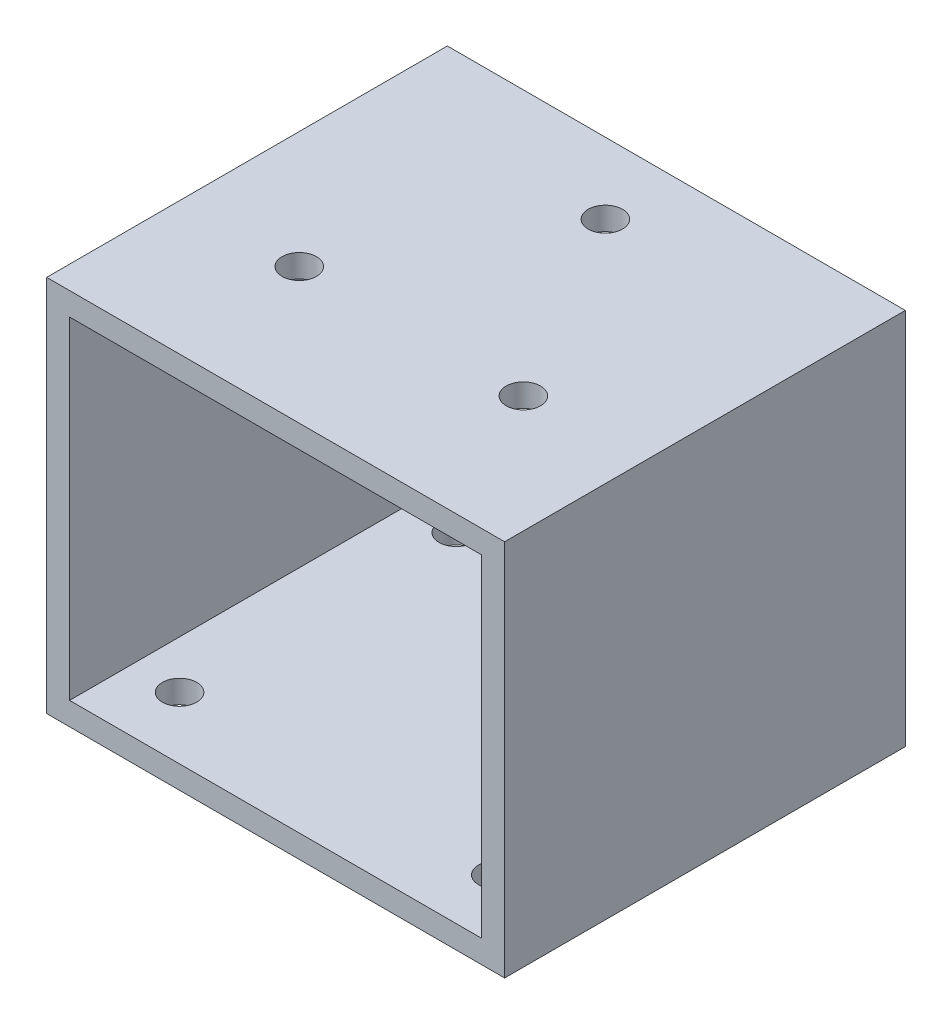
ISO-10303-21;
HEADER;
FILE_DESCRIPTION(('STEP AP214'),'2;1');
FILE_NAME('part.step','',(''),(''),'','','');
FILE_SCHEMA(('AUTOMOTIVE_DESIGN { 1 0 10303 214 1 1 1 1 }'));
ENDSEC;
DATA;
#1=APPLICATION_CONTEXT('core data for automotive mechanical design processes');
#2=APPLICATION_PROTOCOL_DEFINITION('international standard','automotive_design',2000,#1);
#3=PRODUCT_CONTEXT('',#1,'mechanical');
#4=PRODUCT('Part','Part','',(#3));
#5=PRODUCT_RELATED_PRODUCT_CATEGORY('part','',(#4));
#6=PRODUCT_DEFINITION_FORMATION('','',#4);
#7=PRODUCT_DEFINITION_CONTEXT('part definition',#1,'design');
#8=PRODUCT_DEFINITION('design','',#6,#7);
#9=PRODUCT_DEFINITION_SHAPE('','',#8);
#10=(LENGTH_UNIT() NAMED_UNIT(*) SI_UNIT(.MILLI.,.METRE.));
#11=(NAMED_UNIT(*) PLANE_ANGLE_UNIT() SI_UNIT($,.RADIAN.));
#12=(NAMED_UNIT(*) SI_UNIT($,.STERADIAN.) SOLID_ANGLE_UNIT());
#13=UNCERTAINTY_MEASURE_WITH_UNIT(LENGTH_MEASURE(1.E-05),#10,'distance_accuracy_value','');
#14=(GEOMETRIC_REPRESENTATION_CONTEXT(3) GLOBAL_UNCERTAINTY_ASSIGNED_CONTEXT((#13)) GLOBAL_UNIT_ASSIGNED_CONTEXT((#10,
#11,#12)) REPRESENTATION_CONTEXT('',''));
#15=CARTESIAN_POINT('',(0.,0.,0.));
#16=DIRECTION('',(0.,0.,1.));
#17=DIRECTION('',(1.,0.,0.));
#18=AXIS2_PLACEMENT_3D('',#15,#16,#17);
#19=CARTESIAN_POINT('',(0.,0.,35.));
#20=DIRECTION('',(0.,0.,1.));
#21=DIRECTION('',(1.,0.,0.));
#22=AXIS2_PLACEMENT_3D('',#19,#20,#21);
#23=PLANE('',#22);
#24=DIRECTION('',(0.,-1.,0.));
#25=VECTOR('',#24,1.);
#26=CARTESIAN_POINT('',(-20.,16.5,35.));
#27=LINE('',#26,#25);
#28=CARTESIAN_POINT('',(-20.,16.5,35.));
#29=VERTEX_POINT('',#28);
#30=CARTESIAN_POINT('',(-20.,-16.5,35.));
#31=VERTEX_POINT('',#30);
#32=EDGE_CURVE('E138',#29,#31,#27,.T.);
#33=ORIENTED_EDGE('',*,*,#32,.T.);
#34=DIRECTION('',(1.,0.,0.));
#35=VECTOR('',#34,1.);
#36=CARTESIAN_POINT('',(-20.,-16.5,35.));
#37=LINE('',#36,#35);
#38=CARTESIAN_POINT('',(20.,-16.5,35.));
#39=VERTEX_POINT('',#38);
#40=EDGE_CURVE('E141',#31,#39,#37,.T.);
#41=ORIENTED_EDGE('',*,*,#40,.T.);
#42=DIRECTION('',(0.,1.,0.));
#43=VECTOR('',#42,1.);
#44=CARTESIAN_POINT('',(20.,16.5,35.));
#45=LINE('',#44,#43);
#46=CARTESIAN_POINT('',(20.,16.5,35.));
#47=VERTEX_POINT('',#46);
#48=EDGE_CURVE('E144',#39,#47,#45,.T.);
#49=ORIENTED_EDGE('',*,*,#48,.T.);
#50=DIRECTION('',(-1.,0.,0.));
#51=VECTOR('',#50,1.);
#52=CARTESIAN_POINT('',(-20.,16.5,35.));
#53=LINE('',#52,#51);
#54=EDGE_CURVE('E146',#47,#29,#53,.T.);
#55=ORIENTED_EDGE('',*,*,#54,.T.);
#56=EDGE_LOOP('',(#33,#41,#49,#55));
#57=FACE_BOUND('',#56,.T.);
#58=DIRECTION('',(1.,0.,0.));
#59=VECTOR('',#58,1.);
#60=CARTESIAN_POINT('',(-18.,-14.5,35.));
#61=LINE('',#60,#59);
#62=CARTESIAN_POINT('',(-18.,-14.5,35.));
#63=VERTEX_POINT('',#62);
#64=CARTESIAN_POINT('',(18.,-14.5,35.));
#65=VERTEX_POINT('',#64);
#66=EDGE_CURVE('E108',#63,#65,#61,.T.);
#67=ORIENTED_EDGE('',*,*,#66,.F.);
#68=DIRECTION('',(0.,-1.,0.));
#69=VECTOR('',#68,1.);
#70=CARTESIAN_POINT('',(-18.,14.5,35.));
#71=LINE('',#70,#69);
#72=CARTESIAN_POINT('',(-18.,14.5,35.));
#73=VERTEX_POINT('',#72);
#74=EDGE_CURVE('E100',#73,#63,#71,.T.);
#75=ORIENTED_EDGE('',*,*,#74,.F.);
#76=DIRECTION('',(-1.,0.,0.));
#77=VECTOR('',#76,1.);
#78=CARTESIAN_POINT('',(-18.,14.5,35.));
#79=LINE('',#78,#77);
#80=CARTESIAN_POINT('',(18.,14.5,35.));
#81=VERTEX_POINT('',#80);
#82=EDGE_CURVE('E122',#81,#73,#79,.T.);
#83=ORIENTED_EDGE('',*,*,#82,.F.);
#84=DIRECTION('',(0.,1.,0.));
#85=VECTOR('',#84,1.);
#86=CARTESIAN_POINT('',(18.,14.5,35.));
#87=LINE('',#86,#85);
#88=EDGE_CURVE('E120',#65,#81,#87,.T.);
#89=ORIENTED_EDGE('',*,*,#88,.F.);
#90=EDGE_LOOP('',(#67,#75,#83,#89));
#91=FACE_BOUND('',#90,.T.);
#92=ADVANCED_FACE('F33',(#57,#91),#23,.T.);
#93=CARTESIAN_POINT('',(0.,0.,0.));
#94=DIRECTION('',(0.,0.,1.));
#95=DIRECTION('',(1.,0.,0.));
#96=AXIS2_PLACEMENT_3D('',#93,#94,#95);
#97=PLANE('',#96);
#98=DIRECTION('',(0.,-1.,0.));
#99=VECTOR('',#98,1.);
#100=CARTESIAN_POINT('',(-20.,16.5,0.));
#101=LINE('',#100,#99);
#102=CARTESIAN_POINT('',(-20.,16.5,0.));
#103=VERTEX_POINT('',#102);
#104=CARTESIAN_POINT('',(-20.,-16.5,0.));
#105=VERTEX_POINT('',#104);
#106=EDGE_CURVE('E116',#103,#105,#101,.T.);
#107=ORIENTED_EDGE('',*,*,#106,.F.);
#108=DIRECTION('',(-1.,0.,0.));
#109=VECTOR('',#108,1.);
#110=CARTESIAN_POINT('',(-20.,16.5,0.));
#111=LINE('',#110,#109);
#112=CARTESIAN_POINT('',(20.,16.5,0.));
#113=VERTEX_POINT('',#112);
#114=EDGE_CURVE('E142',#113,#103,#111,.T.);
#115=ORIENTED_EDGE('',*,*,#114,.F.);
#116=DIRECTION('',(0.,1.,0.));
#117=VECTOR('',#116,1.);
#118=CARTESIAN_POINT('',(20.,16.5,0.));
#119=LINE('',#118,#117);
#120=CARTESIAN_POINT('',(20.,-16.5,0.));
#121=VERTEX_POINT('',#120);
#122=EDGE_CURVE('E153',#121,#113,#119,.T.);
#123=ORIENTED_EDGE('',*,*,#122,.F.);
#124=DIRECTION('',(1.,0.,0.));
#125=VECTOR('',#124,1.);
#126=CARTESIAN_POINT('',(-20.,-16.5,0.));
#127=LINE('',#126,#125);
#128=EDGE_CURVE('E151',#105,#121,#127,.T.);
#129=ORIENTED_EDGE('',*,*,#128,.F.);
#130=EDGE_LOOP('',(#107,#115,#123,#129));
#131=FACE_BOUND('',#130,.T.);
#132=DIRECTION('',(0.,-1.,0.));
#133=VECTOR('',#132,1.);
#134=CARTESIAN_POINT('',(-18.,14.5,0.));
#135=LINE('',#134,#133);
#136=CARTESIAN_POINT('',(-18.,14.5,0.));
#137=VERTEX_POINT('',#136);
#138=CARTESIAN_POINT('',(-18.,-14.5,0.));
#139=VERTEX_POINT('',#138);
#140=EDGE_CURVE('E58',#137,#139,#135,.T.);
#141=ORIENTED_EDGE('',*,*,#140,.T.);
#142=DIRECTION('',(1.,0.,0.));
#143=VECTOR('',#142,1.);
#144=CARTESIAN_POINT('',(-18.,-14.5,0.));
#145=LINE('',#144,#143);
#146=CARTESIAN_POINT('',(18.,-14.5,0.));
#147=VERTEX_POINT('',#146);
#148=EDGE_CURVE('E115',#139,#147,#145,.T.);
#149=ORIENTED_EDGE('',*,*,#148,.T.);
#150=DIRECTION('',(0.,1.,0.));
#151=VECTOR('',#150,1.);
#152=CARTESIAN_POINT('',(18.,14.5,0.));
#153=LINE('',#152,#151);
#154=CARTESIAN_POINT('',(18.,14.5,0.));
#155=VERTEX_POINT('',#154);
#156=EDGE_CURVE('E130',#147,#155,#153,.T.);
#157=ORIENTED_EDGE('',*,*,#156,.T.);
#158=DIRECTION('',(-1.,0.,0.));
#159=VECTOR('',#158,1.);
#160=CARTESIAN_POINT('',(-18.,14.5,0.));
#161=LINE('',#160,#159);
#162=EDGE_CURVE('E109',#155,#137,#161,.T.);
#163=ORIENTED_EDGE('',*,*,#162,.T.);
#164=EDGE_LOOP('',(#141,#149,#157,#163));
#165=FACE_BOUND('',#164,.T.);
#166=ADVANCED_FACE('F225',(#131,#165),#97,.F.);
#167=CARTESIAN_POINT('',(-20.,16.5,35.));
#168=DIRECTION('',(1.,0.,0.));
#169=DIRECTION('',(0.,0.,-1.));
#170=AXIS2_PLACEMENT_3D('',#167,#168,#169);
#171=PLANE('',#170);
#172=ORIENTED_EDGE('',*,*,#106,.T.);
#173=DIRECTION('',(0.,0.,-1.));
#174=VECTOR('',#173,1.);
#175=CARTESIAN_POINT('',(-20.,-16.5,35.));
#176=LINE('',#175,#174);
#177=EDGE_CURVE('E11',#31,#105,#176,.T.);
#178=ORIENTED_EDGE('',*,*,#177,.F.);
#179=ORIENTED_EDGE('',*,*,#32,.F.);
#180=DIRECTION('',(0.,0.,-1.));
#181=VECTOR('',#180,1.);
#182=CARTESIAN_POINT('',(-20.,16.5,35.));
#183=LINE('',#182,#181);
#184=EDGE_CURVE('E148',#29,#103,#183,.T.);
#185=ORIENTED_EDGE('',*,*,#184,.T.);
#186=EDGE_LOOP('',(#172,#178,#179,#185));
#187=FACE_BOUND('',#186,.T.);
#188=ADVANCED_FACE('F35',(#187),#171,.F.);
#189=CARTESIAN_POINT('',(-20.,-16.5,35.));
#190=DIRECTION('',(0.,1.,0.));
#191=DIRECTION('',(-1.,0.,0.));
#192=AXIS2_PLACEMENT_3D('',#189,#190,#191);
#193=PLANE('',#192);
#194=CARTESIAN_POINT('',(-13.8094685788079,-16.5,29.5832850064569));
#195=DIRECTION('',(0.,-1.,0.));
#196=DIRECTION('',(1.,0.,0.));
#197=AXIS2_PLACEMENT_3D('',#194,#195,#196);
#198=CIRCLE('',#197,1.5);
#199=CARTESIAN_POINT('',(-12.3094685788079,-16.5,29.5832850064569));
#200=VERTEX_POINT('',#199);
#201=EDGE_CURVE('E197',#200,#200,#198,.T.);
#202=ORIENTED_EDGE('',*,*,#201,.F.);
#203=EDGE_LOOP('',(#202));
#204=FACE_BOUND('',#203,.T.);
#205=CARTESIAN_POINT('',(13.8094685788079,-16.5,5.41671499354309));
#206=DIRECTION('',(0.,-1.,0.));
#207=DIRECTION('',(-1.,0.,0.));
#208=AXIS2_PLACEMENT_3D('',#205,#206,#207);
#209=CIRCLE('',#208,1.5);
#210=CARTESIAN_POINT('',(12.3094685788079,-16.5,5.41671499354309));
#211=VERTEX_POINT('',#210);
#212=EDGE_CURVE('E198',#211,#211,#209,.T.);
#213=ORIENTED_EDGE('',*,*,#212,.F.);
#214=EDGE_LOOP('',(#213));
#215=FACE_BOUND('',#214,.T.);
#216=CARTESIAN_POINT('',(-13.8094685788079,-16.5,5.41671499354309));
#217=DIRECTION('',(0.,-1.,0.));
#218=DIRECTION('',(-1.,0.,0.));
#219=AXIS2_PLACEMENT_3D('',#216,#217,#218);
#220=CIRCLE('',#219,1.5);
#221=CARTESIAN_POINT('',(-15.3094685788079,-16.5,5.41671499354309));
#222=VERTEX_POINT('',#221);
#223=EDGE_CURVE('E201',#222,#222,#220,.T.);
#224=ORIENTED_EDGE('',*,*,#223,.F.);
#225=EDGE_LOOP('',(#224));
#226=FACE_BOUND('',#225,.T.);
#227=CARTESIAN_POINT('',(13.8094685788079,-16.5,29.5832850064569));
#228=DIRECTION('',(0.,-1.,0.));
#229=DIRECTION('',(1.,0.,0.));
#230=AXIS2_PLACEMENT_3D('',#227,#228,#229);
#231=CIRCLE('',#230,1.5);
#232=CARTESIAN_POINT('',(15.3094685788079,-16.5,29.5832850064569));
#233=VERTEX_POINT('',#232);
#234=EDGE_CURVE('E176',#233,#233,#231,.T.);
#235=ORIENTED_EDGE('',*,*,#234,.F.);
#236=EDGE_LOOP('',(#235));
#237=FACE_BOUND('',#236,.T.);
#238=ORIENTED_EDGE('',*,*,#128,.T.);
#239=DIRECTION('',(0.,0.,-1.));
#240=VECTOR('',#239,1.);
#241=CARTESIAN_POINT('',(20.,-16.5,35.));
#242=LINE('',#241,#240);
#243=EDGE_CURVE('E42',#39,#121,#242,.T.);
#244=ORIENTED_EDGE('',*,*,#243,.F.);
#245=ORIENTED_EDGE('',*,*,#40,.F.);
#246=ORIENTED_EDGE('',*,*,#177,.T.);
#247=EDGE_LOOP('',(#238,#244,#245,#246));
#248=FACE_BOUND('',#247,.T.);
#249=ADVANCED_FACE('F209',(#204,#215,#226,#237,#248),#193,.F.);
#250=CARTESIAN_POINT('',(20.,16.5,35.));
#251=DIRECTION('',(-1.,0.,0.));
#252=DIRECTION('',(0.,-1.,0.));
#253=AXIS2_PLACEMENT_3D('',#250,#251,#252);
#254=PLANE('',#253);
#255=ORIENTED_EDGE('',*,*,#122,.T.);
#256=DIRECTION('',(0.,0.,-1.));
#257=VECTOR('',#256,1.);
#258=CARTESIAN_POINT('',(20.,16.5,35.));
#259=LINE('',#258,#257);
#260=EDGE_CURVE('E158',#47,#113,#259,.T.);
#261=ORIENTED_EDGE('',*,*,#260,.F.);
#262=ORIENTED_EDGE('',*,*,#48,.F.);
#263=ORIENTED_EDGE('',*,*,#243,.T.);
#264=EDGE_LOOP('',(#255,#261,#262,#263));
#265=FACE_BOUND('',#264,.T.);
#266=ADVANCED_FACE('F212',(#265),#254,.F.);
#267=CARTESIAN_POINT('',(-20.,16.5,35.));
#268=DIRECTION('',(0.,-1.,0.));
#269=DIRECTION('',(1.,0.,0.));
#270=AXIS2_PLACEMENT_3D('',#267,#268,#269);
#271=PLANE('',#270);
#272=CARTESIAN_POINT('',(0.,16.5,6.2));
#273=DIRECTION('',(0.,1.,0.));
#274=DIRECTION('',(-1.,0.,0.));
#275=AXIS2_PLACEMENT_3D('',#272,#273,#274);
#276=CIRCLE('',#275,1.5);
#277=CARTESIAN_POINT('',(-1.5,16.5,6.2));
#278=VERTEX_POINT('',#277);
#279=EDGE_CURVE('E167',#278,#278,#276,.T.);
#280=ORIENTED_EDGE('',*,*,#279,.F.);
#281=EDGE_LOOP('',(#280));
#282=FACE_BOUND('',#281,.T.);
#283=CARTESIAN_POINT('',(9.78608706276461,16.5,23.1499999999998));
#284=DIRECTION('',(0.,1.,0.));
#285=DIRECTION('',(-1.,0.,0.));
#286=AXIS2_PLACEMENT_3D('',#283,#284,#285);
#287=CIRCLE('',#286,1.5);
#288=CARTESIAN_POINT('',(8.28608706276461,16.5,23.1499999999998));
#289=VERTEX_POINT('',#288);
#290=EDGE_CURVE('E187',#289,#289,#287,.T.);
#291=ORIENTED_EDGE('',*,*,#290,.F.);
#292=EDGE_LOOP('',(#291));
#293=FACE_BOUND('',#292,.T.);
#294=CARTESIAN_POINT('',(-9.78608706276374,16.5,23.1500000000002));
#295=DIRECTION('',(0.,1.,0.));
#296=DIRECTION('',(-1.,0.,0.));
#297=AXIS2_PLACEMENT_3D('',#294,#295,#296);
#298=CIRCLE('',#297,1.5);
#299=CARTESIAN_POINT('',(-11.2860870627637,16.5,23.1500000000002));
#300=VERTEX_POINT('',#299);
#301=EDGE_CURVE('E183',#300,#300,#298,.T.);
#302=ORIENTED_EDGE('',*,*,#301,.F.);
#303=EDGE_LOOP('',(#302));
#304=FACE_BOUND('',#303,.T.);
#305=ORIENTED_EDGE('',*,*,#114,.T.);
#306=ORIENTED_EDGE('',*,*,#184,.F.);
#307=ORIENTED_EDGE('',*,*,#54,.F.);
#308=ORIENTED_EDGE('',*,*,#260,.T.);
#309=EDGE_LOOP('',(#305,#306,#307,#308));
#310=FACE_BOUND('',#309,.T.);
#311=ADVANCED_FACE('F229',(#282,#293,#304,#310),#271,.F.);
#312=CARTESIAN_POINT('',(-18.,14.5,35.));
#313=DIRECTION('',(1.,0.,0.));
#314=DIRECTION('',(0.,0.,-1.));
#315=AXIS2_PLACEMENT_3D('',#312,#313,#314);
#316=PLANE('',#315);
#317=ORIENTED_EDGE('',*,*,#140,.F.);
#318=DIRECTION('',(0.,0.,-1.));
#319=VECTOR('',#318,1.);
#320=CARTESIAN_POINT('',(-18.,14.5,35.));
#321=LINE('',#320,#319);
#322=EDGE_CURVE('E104',#73,#137,#321,.T.);
#323=ORIENTED_EDGE('',*,*,#322,.F.);
#324=ORIENTED_EDGE('',*,*,#74,.T.);
#325=DIRECTION('',(0.,0.,-1.));
#326=VECTOR('',#325,1.);
#327=CARTESIAN_POINT('',(-18.,-14.5,35.));
#328=LINE('',#327,#326);
#329=EDGE_CURVE('E103',#63,#139,#328,.T.);
#330=ORIENTED_EDGE('',*,*,#329,.T.);
#331=EDGE_LOOP('',(#317,#323,#324,#330));
#332=FACE_BOUND('',#331,.T.);
#333=ADVANCED_FACE('F102',(#332),#316,.T.);
#334=CARTESIAN_POINT('',(-18.,-14.5,35.));
#335=DIRECTION('',(0.,1.,0.));
#336=DIRECTION('',(-1.,0.,0.));
#337=AXIS2_PLACEMENT_3D('',#334,#335,#336);
#338=PLANE('',#337);
#339=CARTESIAN_POINT('',(-13.8094685788079,-14.5,29.5832850064569));
#340=DIRECTION('',(0.,1.,0.));
#341=DIRECTION('',(-1.,0.,0.));
#342=AXIS2_PLACEMENT_3D('',#339,#340,#341);
#343=CIRCLE('',#342,1.5);
#344=CARTESIAN_POINT('',(-15.3094685788079,-14.5,29.5832850064569));
#345=VERTEX_POINT('',#344);
#346=EDGE_CURVE('E37',#345,#345,#343,.T.);
#347=ORIENTED_EDGE('',*,*,#346,.F.);
#348=EDGE_LOOP('',(#347));
#349=FACE_BOUND('',#348,.T.);
#350=CARTESIAN_POINT('',(13.8094685788079,-14.5,5.41671499354309));
#351=DIRECTION('',(0.,1.,0.));
#352=DIRECTION('',(-1.,0.,0.));
#353=AXIS2_PLACEMENT_3D('',#350,#351,#352);
#354=CIRCLE('',#353,1.5);
#355=CARTESIAN_POINT('',(12.3094685788079,-14.5,5.41671499354309));
#356=VERTEX_POINT('',#355);
#357=EDGE_CURVE('E178',#356,#356,#354,.T.);
#358=ORIENTED_EDGE('',*,*,#357,.F.);
#359=EDGE_LOOP('',(#358));
#360=FACE_BOUND('',#359,.T.);
#361=CARTESIAN_POINT('',(-13.8094685788079,-14.5,5.41671499354309));
#362=DIRECTION('',(0.,1.,0.));
#363=DIRECTION('',(-1.,0.,0.));
#364=AXIS2_PLACEMENT_3D('',#361,#362,#363);
#365=CIRCLE('',#364,1.5);
#366=CARTESIAN_POINT('',(-15.3094685788079,-14.5,5.41671499354309));
#367=VERTEX_POINT('',#366);
#368=EDGE_CURVE('E175',#367,#367,#365,.T.);
#369=ORIENTED_EDGE('',*,*,#368,.F.);
#370=EDGE_LOOP('',(#369));
#371=FACE_BOUND('',#370,.T.);
#372=CARTESIAN_POINT('',(13.8094685788079,-14.5,29.5832850064569));
#373=DIRECTION('',(0.,1.,0.));
#374=DIRECTION('',(-1.,0.,0.));
#375=AXIS2_PLACEMENT_3D('',#372,#373,#374);
#376=CIRCLE('',#375,1.5);
#377=CARTESIAN_POINT('',(12.3094685788079,-14.5,29.5832850064569));
#378=VERTEX_POINT('',#377);
#379=EDGE_CURVE('E172',#378,#378,#376,.T.);
#380=ORIENTED_EDGE('',*,*,#379,.F.);
#381=EDGE_LOOP('',(#380));
#382=FACE_BOUND('',#381,.T.);
#383=ORIENTED_EDGE('',*,*,#148,.F.);
#384=ORIENTED_EDGE('',*,*,#329,.F.);
#385=ORIENTED_EDGE('',*,*,#66,.T.);
#386=DIRECTION('',(0.,0.,-1.));
#387=VECTOR('',#386,1.);
#388=CARTESIAN_POINT('',(18.,-14.5,35.));
#389=LINE('',#388,#387);
#390=EDGE_CURVE('E117',#65,#147,#389,.T.);
#391=ORIENTED_EDGE('',*,*,#390,.T.);
#392=EDGE_LOOP('',(#383,#384,#385,#391));
#393=FACE_BOUND('',#392,.T.);
#394=ADVANCED_FACE('F112',(#349,#360,#371,#382,#393),#338,.T.);
#395=CARTESIAN_POINT('',(18.,14.5,35.));
#396=DIRECTION('',(-1.,0.,0.));
#397=DIRECTION('',(0.,-1.,0.));
#398=AXIS2_PLACEMENT_3D('',#395,#396,#397);
#399=PLANE('',#398);
#400=ORIENTED_EDGE('',*,*,#156,.F.);
#401=ORIENTED_EDGE('',*,*,#390,.F.);
#402=ORIENTED_EDGE('',*,*,#88,.T.);
#403=DIRECTION('',(0.,0.,-1.));
#404=VECTOR('',#403,1.);
#405=CARTESIAN_POINT('',(18.,14.5,35.));
#406=LINE('',#405,#404);
#407=EDGE_CURVE('E50',#81,#155,#406,.T.);
#408=ORIENTED_EDGE('',*,*,#407,.T.);
#409=EDGE_LOOP('',(#400,#401,#402,#408));
#410=FACE_BOUND('',#409,.T.);
#411=ADVANCED_FACE('F274',(#410),#399,.T.);
#412=CARTESIAN_POINT('',(-18.,14.5,35.));
#413=DIRECTION('',(0.,-1.,0.));
#414=DIRECTION('',(0.,0.,-1.));
#415=AXIS2_PLACEMENT_3D('',#412,#413,#414);
#416=PLANE('',#415);
#417=CARTESIAN_POINT('',(0.,14.5,6.2));
#418=DIRECTION('',(0.,-1.,0.));
#419=DIRECTION('',(0.,0.,-1.));
#420=AXIS2_PLACEMENT_3D('',#417,#418,#419);
#421=CIRCLE('',#420,1.5);
#422=CARTESIAN_POINT('',(0.,14.5,4.7));
#423=VERTEX_POINT('',#422);
#424=EDGE_CURVE('E128',#423,#423,#421,.T.);
#425=ORIENTED_EDGE('',*,*,#424,.F.);
#426=EDGE_LOOP('',(#425));
#427=FACE_BOUND('',#426,.T.);
#428=CARTESIAN_POINT('',(9.78608706276461,14.5,23.1499999999998));
#429=DIRECTION('',(0.,-1.,0.));
#430=DIRECTION('',(0.,0.,-1.));
#431=AXIS2_PLACEMENT_3D('',#428,#429,#430);
#432=CIRCLE('',#431,1.5);
#433=CARTESIAN_POINT('',(9.78608706276461,14.5,21.6499999999998));
#434=VERTEX_POINT('',#433);
#435=EDGE_CURVE('E166',#434,#434,#432,.T.);
#436=ORIENTED_EDGE('',*,*,#435,.F.);
#437=EDGE_LOOP('',(#436));
#438=FACE_BOUND('',#437,.T.);
#439=CARTESIAN_POINT('',(-9.78608706276374,14.5,23.1500000000002));
#440=DIRECTION('',(0.,-1.,0.));
#441=DIRECTION('',(0.,0.,-1.));
#442=AXIS2_PLACEMENT_3D('',#439,#440,#441);
#443=CIRCLE('',#442,1.5);
#444=CARTESIAN_POINT('',(-9.78608706276374,14.5,21.6500000000002));
#445=VERTEX_POINT('',#444);
#446=EDGE_CURVE('E163',#445,#445,#443,.T.);
#447=ORIENTED_EDGE('',*,*,#446,.F.);
#448=EDGE_LOOP('',(#447));
#449=FACE_BOUND('',#448,.T.);
#450=ORIENTED_EDGE('',*,*,#162,.F.);
#451=ORIENTED_EDGE('',*,*,#407,.F.);
#452=ORIENTED_EDGE('',*,*,#82,.T.);
#453=ORIENTED_EDGE('',*,*,#322,.T.);
#454=EDGE_LOOP('',(#450,#451,#452,#453));
#455=FACE_BOUND('',#454,.T.);
#456=ADVANCED_FACE('F283',(#427,#438,#449,#455),#416,.T.);
#457=CARTESIAN_POINT('',(-9.78608706276373,1.50000000000002,23.1500000000002));
#458=DIRECTION('',(0.,1.,0.));
#459=DIRECTION('',(-1.,0.,0.));
#460=AXIS2_PLACEMENT_3D('',#457,#458,#459);
#461=CYLINDRICAL_SURFACE('',#460,1.5);
#462=ORIENTED_EDGE('',*,*,#446,.T.);
#463=EDGE_LOOP('',(#462));
#464=FACE_BOUND('',#463,.T.);
#465=ORIENTED_EDGE('',*,*,#301,.T.);
#466=EDGE_LOOP('',(#465));
#467=FACE_BOUND('',#466,.T.);
#468=ADVANCED_FACE('F290',(#464,#467),#461,.F.);
#469=CARTESIAN_POINT('',(9.78608706276461,1.50000000000002,23.1499999999998));
#470=DIRECTION('',(0.,1.,0.));
#471=DIRECTION('',(-1.,0.,0.));
#472=AXIS2_PLACEMENT_3D('',#469,#470,#471);
#473=CYLINDRICAL_SURFACE('',#472,1.5);
#474=ORIENTED_EDGE('',*,*,#435,.T.);
#475=EDGE_LOOP('',(#474));
#476=FACE_BOUND('',#475,.T.);
#477=ORIENTED_EDGE('',*,*,#290,.T.);
#478=EDGE_LOOP('',(#477));
#479=FACE_BOUND('',#478,.T.);
#480=ADVANCED_FACE('F300',(#476,#479),#473,.F.);
#481=CARTESIAN_POINT('',(0.,1.50000000000002,6.2));
#482=DIRECTION('',(0.,1.,0.));
#483=DIRECTION('',(-1.,0.,0.));
#484=AXIS2_PLACEMENT_3D('',#481,#482,#483);
#485=CYLINDRICAL_SURFACE('',#484,1.5);
#486=ORIENTED_EDGE('',*,*,#424,.T.);
#487=EDGE_LOOP('',(#486));
#488=FACE_BOUND('',#487,.T.);
#489=ORIENTED_EDGE('',*,*,#279,.T.);
#490=EDGE_LOOP('',(#489));
#491=FACE_BOUND('',#490,.T.);
#492=ADVANCED_FACE('F307',(#488,#491),#485,.F.);
#493=CARTESIAN_POINT('',(13.8094685788079,-1.50000000000001,29.5832850064569));
#494=DIRECTION('',(0.,-1.,0.));
#495=DIRECTION('',(1.,0.,0.));
#496=AXIS2_PLACEMENT_3D('',#493,#494,#495);
#497=CYLINDRICAL_SURFACE('',#496,1.5);
#498=ORIENTED_EDGE('',*,*,#379,.T.);
#499=EDGE_LOOP('',(#498));
#500=FACE_BOUND('',#499,.T.);
#501=ORIENTED_EDGE('',*,*,#234,.T.);
#502=EDGE_LOOP('',(#501));
#503=FACE_BOUND('',#502,.T.);
#504=ADVANCED_FACE('F315',(#500,#503),#497,.F.);
#505=CARTESIAN_POINT('',(-13.8094685788079,-1.50000000000002,5.41671499354309));
#506=DIRECTION('',(0.,-1.,0.));
#507=DIRECTION('',(1.,0.,0.));
#508=AXIS2_PLACEMENT_3D('',#505,#506,#507);
#509=CYLINDRICAL_SURFACE('',#508,1.5);
#510=ORIENTED_EDGE('',*,*,#368,.T.);
#511=EDGE_LOOP('',(#510));
#512=FACE_BOUND('',#511,.T.);
#513=ORIENTED_EDGE('',*,*,#223,.T.);
#514=EDGE_LOOP('',(#513));
#515=FACE_BOUND('',#514,.T.);
#516=ADVANCED_FACE('F207',(#512,#515),#509,.F.);
#517=CARTESIAN_POINT('',(13.8094685788079,-1.50000000000001,5.41671499354309));
#518=DIRECTION('',(0.,-1.,0.));
#519=DIRECTION('',(1.,0.,0.));
#520=AXIS2_PLACEMENT_3D('',#517,#518,#519);
#521=CYLINDRICAL_SURFACE('',#520,1.5);
#522=ORIENTED_EDGE('',*,*,#357,.T.);
#523=EDGE_LOOP('',(#522));
#524=FACE_BOUND('',#523,.T.);
#525=ORIENTED_EDGE('',*,*,#212,.T.);
#526=EDGE_LOOP('',(#525));
#527=FACE_BOUND('',#526,.T.);
#528=ADVANCED_FACE('F329',(#524,#527),#521,.F.);
#529=CARTESIAN_POINT('',(-13.8094685788079,-1.50000000000002,29.5832850064569));
#530=DIRECTION('',(0.,-1.,0.));
#531=DIRECTION('',(1.,0.,0.));
#532=AXIS2_PLACEMENT_3D('',#529,#530,#531);
#533=CYLINDRICAL_SURFACE('',#532,1.5);
#534=ORIENTED_EDGE('',*,*,#346,.T.);
#535=EDGE_LOOP('',(#534));
#536=FACE_BOUND('',#535,.T.);
#537=ORIENTED_EDGE('',*,*,#201,.T.);
#538=EDGE_LOOP('',(#537));
#539=FACE_BOUND('',#538,.T.);
#540=ADVANCED_FACE('F337',(#536,#539),#533,.F.);
#541=CLOSED_SHELL('',(#92,#166,#188,#249,#266,#311,#333,#394,#411,#456,#468,#480,#492,#504,#516,
#528,#540));
#542=MANIFOLD_SOLID_BREP('B2',#541);
#543=ADVANCED_BREP_SHAPE_REPRESENTATION('',(#18,#542),#14);
#544=SHAPE_DEFINITION_REPRESENTATION(#9,#543);
ENDSEC;
END-ISO-10303-21;
